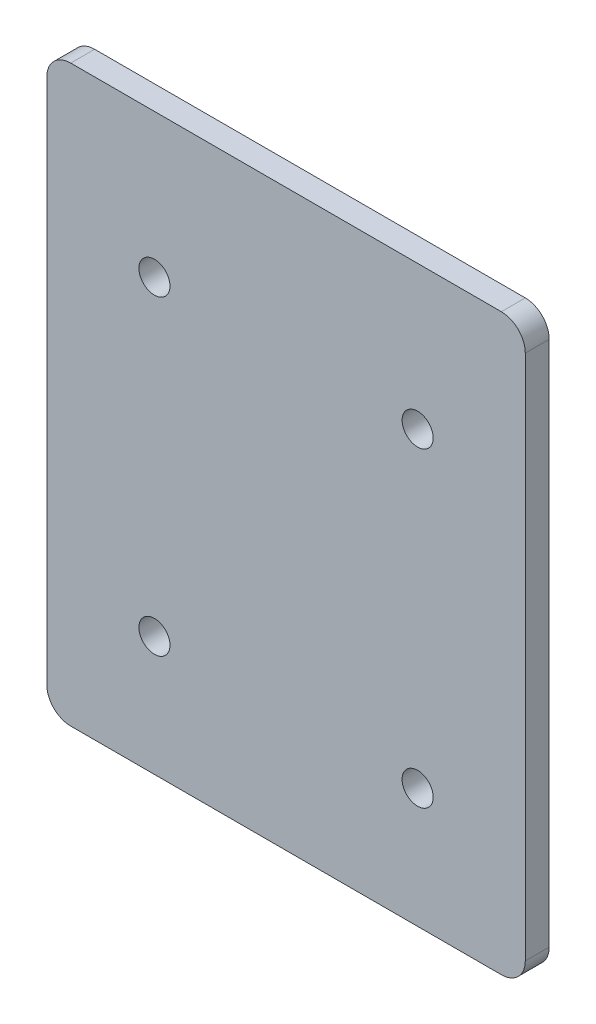
ISO-10303-21;
HEADER;
FILE_DESCRIPTION(('STEP AP214'),'2;1');
FILE_NAME('part.step','',(''),(''),'','','');
FILE_SCHEMA(('AUTOMOTIVE_DESIGN { 1 0 10303 214 1 1 1 1 }'));
ENDSEC;
DATA;
#1=APPLICATION_CONTEXT('core data for automotive mechanical design processes');
#2=APPLICATION_PROTOCOL_DEFINITION('international standard','automotive_design',2000,#1);
#3=PRODUCT_CONTEXT('',#1,'mechanical');
#4=PRODUCT('Part','Part','',(#3));
#5=PRODUCT_RELATED_PRODUCT_CATEGORY('part','',(#4));
#6=PRODUCT_DEFINITION_FORMATION('','',#4);
#7=PRODUCT_DEFINITION_CONTEXT('part definition',#1,'design');
#8=PRODUCT_DEFINITION('design','',#6,#7);
#9=PRODUCT_DEFINITION_SHAPE('','',#8);
#10=(LENGTH_UNIT() NAMED_UNIT(*) SI_UNIT(.MILLI.,.METRE.));
#11=(NAMED_UNIT(*) PLANE_ANGLE_UNIT() SI_UNIT($,.RADIAN.));
#12=(NAMED_UNIT(*) SI_UNIT($,.STERADIAN.) SOLID_ANGLE_UNIT());
#13=UNCERTAINTY_MEASURE_WITH_UNIT(LENGTH_MEASURE(1.E-05),#10,'distance_accuracy_value','');
#14=(GEOMETRIC_REPRESENTATION_CONTEXT(3) GLOBAL_UNCERTAINTY_ASSIGNED_CONTEXT((#13)) GLOBAL_UNIT_ASSIGNED_CONTEXT((#10,
#11,#12)) REPRESENTATION_CONTEXT('',''));
#15=CARTESIAN_POINT('',(0.,0.,0.));
#16=DIRECTION('',(0.,0.,1.));
#17=DIRECTION('',(1.,0.,0.));
#18=AXIS2_PLACEMENT_3D('',#15,#16,#17);
#19=CARTESIAN_POINT('',(50.,-60.,-5.));
#20=DIRECTION('',(1.,0.,0.));
#21=DIRECTION('',(0.,0.,-1.));
#22=AXIS2_PLACEMENT_3D('',#19,#20,#21);
#23=PLANE('',#22);
#24=DIRECTION('',(0.,1.,0.));
#25=VECTOR('',#24,1.);
#26=CARTESIAN_POINT('',(50.,-60.,-5.));
#27=LINE('',#26,#25);
#28=CARTESIAN_POINT('',(50.,-55.,-5.));
#29=VERTEX_POINT('',#28);
#30=CARTESIAN_POINT('',(50.,55.,-5.));
#31=VERTEX_POINT('',#30);
#32=EDGE_CURVE('E168',#29,#31,#27,.T.);
#33=ORIENTED_EDGE('',*,*,#32,.T.);
#34=DIRECTION('',(0.,0.,1.));
#35=VECTOR('',#34,1.);
#36=CARTESIAN_POINT('',(50.,55.,-5.));
#37=LINE('',#36,#35);
#38=CARTESIAN_POINT('',(50.,55.,0.));
#39=VERTEX_POINT('',#38);
#40=EDGE_CURVE('E122',#31,#39,#37,.T.);
#41=ORIENTED_EDGE('',*,*,#40,.T.);
#42=DIRECTION('',(0.,1.,0.));
#43=VECTOR('',#42,1.);
#44=CARTESIAN_POINT('',(50.,-60.,0.));
#45=LINE('',#44,#43);
#46=CARTESIAN_POINT('',(50.,-55.,0.));
#47=VERTEX_POINT('',#46);
#48=EDGE_CURVE('E106',#47,#39,#45,.T.);
#49=ORIENTED_EDGE('',*,*,#48,.F.);
#50=DIRECTION('',(0.,0.,1.));
#51=VECTOR('',#50,1.);
#52=CARTESIAN_POINT('',(50.,-55.,-5.));
#53=LINE('',#52,#51);
#54=EDGE_CURVE('E119',#47,#29,#53,.F.);
#55=ORIENTED_EDGE('',*,*,#54,.T.);
#56=EDGE_LOOP('',(#33,#41,#49,#55));
#57=FACE_BOUND('',#56,.T.);
#58=ADVANCED_FACE('F37',(#57),#23,.T.);
#59=CARTESIAN_POINT('',(-50.,-60.,-5.));
#60=DIRECTION('',(0.,-1.,0.));
#61=DIRECTION('',(0.,0.,-1.));
#62=AXIS2_PLACEMENT_3D('',#59,#60,#61);
#63=PLANE('',#62);
#64=DIRECTION('',(1.,0.,0.));
#65=VECTOR('',#64,1.);
#66=CARTESIAN_POINT('',(-50.,-60.,-5.));
#67=LINE('',#66,#65);
#68=CARTESIAN_POINT('',(-45.,-60.,-5.));
#69=VERTEX_POINT('',#68);
#70=CARTESIAN_POINT('',(45.,-60.,-5.));
#71=VERTEX_POINT('',#70);
#72=EDGE_CURVE('E129',#69,#71,#67,.T.);
#73=ORIENTED_EDGE('',*,*,#72,.T.);
#74=DIRECTION('',(0.,0.,1.));
#75=VECTOR('',#74,1.);
#76=CARTESIAN_POINT('',(45.,-60.,-5.));
#77=LINE('',#76,#75);
#78=CARTESIAN_POINT('',(45.,-60.,0.));
#79=VERTEX_POINT('',#78);
#80=EDGE_CURVE('E155',#71,#79,#77,.T.);
#81=ORIENTED_EDGE('',*,*,#80,.T.);
#82=DIRECTION('',(1.,0.,0.));
#83=VECTOR('',#82,1.);
#84=CARTESIAN_POINT('',(-50.,-60.,0.));
#85=LINE('',#84,#83);
#86=CARTESIAN_POINT('',(-45.,-60.,0.));
#87=VERTEX_POINT('',#86);
#88=EDGE_CURVE('E108',#87,#79,#85,.T.);
#89=ORIENTED_EDGE('',*,*,#88,.F.);
#90=DIRECTION('',(0.,0.,1.));
#91=VECTOR('',#90,1.);
#92=CARTESIAN_POINT('',(-45.,-60.,-5.));
#93=LINE('',#92,#91);
#94=EDGE_CURVE('E153',#87,#69,#93,.F.);
#95=ORIENTED_EDGE('',*,*,#94,.T.);
#96=EDGE_LOOP('',(#73,#81,#89,#95));
#97=FACE_BOUND('',#96,.T.);
#98=ADVANCED_FACE('F157',(#97),#63,.T.);
#99=CARTESIAN_POINT('',(-50.,-60.,-5.));
#100=DIRECTION('',(-1.,0.,0.));
#101=DIRECTION('',(0.,0.,1.));
#102=AXIS2_PLACEMENT_3D('',#99,#100,#101);
#103=PLANE('',#102);
#104=DIRECTION('',(0.,-1.,0.));
#105=VECTOR('',#104,1.);
#106=CARTESIAN_POINT('',(-50.,-60.,-5.));
#107=LINE('',#106,#105);
#108=CARTESIAN_POINT('',(-50.,55.,-5.));
#109=VERTEX_POINT('',#108);
#110=CARTESIAN_POINT('',(-50.,-55.,-5.));
#111=VERTEX_POINT('',#110);
#112=EDGE_CURVE('E134',#109,#111,#107,.T.);
#113=ORIENTED_EDGE('',*,*,#112,.T.);
#114=DIRECTION('',(0.,0.,1.));
#115=VECTOR('',#114,1.);
#116=CARTESIAN_POINT('',(-50.,-55.,-5.));
#117=LINE('',#116,#115);
#118=CARTESIAN_POINT('',(-50.,-55.,0.));
#119=VERTEX_POINT('',#118);
#120=EDGE_CURVE('E11',#111,#119,#117,.T.);
#121=ORIENTED_EDGE('',*,*,#120,.T.);
#122=DIRECTION('',(0.,-1.,0.));
#123=VECTOR('',#122,1.);
#124=CARTESIAN_POINT('',(-50.,-60.,0.));
#125=LINE('',#124,#123);
#126=CARTESIAN_POINT('',(-50.,55.,0.));
#127=VERTEX_POINT('',#126);
#128=EDGE_CURVE('E166',#127,#119,#125,.T.);
#129=ORIENTED_EDGE('',*,*,#128,.F.);
#130=DIRECTION('',(0.,0.,1.));
#131=VECTOR('',#130,1.);
#132=CARTESIAN_POINT('',(-50.,55.,-5.));
#133=LINE('',#132,#131);
#134=EDGE_CURVE('E45',#127,#109,#133,.F.);
#135=ORIENTED_EDGE('',*,*,#134,.T.);
#136=EDGE_LOOP('',(#113,#121,#129,#135));
#137=FACE_BOUND('',#136,.T.);
#138=ADVANCED_FACE('F165',(#137),#103,.T.);
#139=CARTESIAN_POINT('',(-50.,60.,-5.));
#140=DIRECTION('',(0.,1.,0.));
#141=DIRECTION('',(0.,0.,1.));
#142=AXIS2_PLACEMENT_3D('',#139,#140,#141);
#143=PLANE('',#142);
#144=DIRECTION('',(-1.,0.,0.));
#145=VECTOR('',#144,1.);
#146=CARTESIAN_POINT('',(-50.,60.,0.));
#147=LINE('',#146,#145);
#148=CARTESIAN_POINT('',(45.,60.,0.));
#149=VERTEX_POINT('',#148);
#150=CARTESIAN_POINT('',(-45.,60.,0.));
#151=VERTEX_POINT('',#150);
#152=EDGE_CURVE('E123',#149,#151,#147,.T.);
#153=ORIENTED_EDGE('',*,*,#152,.F.);
#154=DIRECTION('',(0.,0.,1.));
#155=VECTOR('',#154,1.);
#156=CARTESIAN_POINT('',(45.,60.,-5.));
#157=LINE('',#156,#155);
#158=CARTESIAN_POINT('',(45.,60.,-5.));
#159=VERTEX_POINT('',#158);
#160=EDGE_CURVE('E145',#149,#159,#157,.F.);
#161=ORIENTED_EDGE('',*,*,#160,.T.);
#162=DIRECTION('',(-1.,0.,0.));
#163=VECTOR('',#162,1.);
#164=CARTESIAN_POINT('',(-50.,60.,-5.));
#165=LINE('',#164,#163);
#166=CARTESIAN_POINT('',(-45.,60.,-5.));
#167=VERTEX_POINT('',#166);
#168=EDGE_CURVE('E172',#159,#167,#165,.T.);
#169=ORIENTED_EDGE('',*,*,#168,.T.);
#170=DIRECTION('',(0.,0.,1.));
#171=VECTOR('',#170,1.);
#172=CARTESIAN_POINT('',(-45.,60.,-5.));
#173=LINE('',#172,#171);
#174=EDGE_CURVE('E142',#167,#151,#173,.T.);
#175=ORIENTED_EDGE('',*,*,#174,.T.);
#176=EDGE_LOOP('',(#153,#161,#169,#175));
#177=FACE_BOUND('',#176,.T.);
#178=ADVANCED_FACE('F239',(#177),#143,.T.);
#179=CARTESIAN_POINT('',(0.,0.,-5.));
#180=DIRECTION('',(0.,0.,-1.));
#181=DIRECTION('',(-1.,0.,0.));
#182=AXIS2_PLACEMENT_3D('',#179,#180,#181);
#183=PLANE('',#182);
#184=CARTESIAN_POINT('',(27.5,-35.,-5.));
#185=DIRECTION('',(0.,0.,1.));
#186=DIRECTION('',(1.,0.,0.));
#187=AXIS2_PLACEMENT_3D('',#184,#185,#186);
#188=CIRCLE('',#187,3.25);
#189=CARTESIAN_POINT('',(30.75,-35.,-5.));
#190=VERTEX_POINT('',#189);
#191=EDGE_CURVE('E191',#190,#190,#188,.T.);
#192=ORIENTED_EDGE('',*,*,#191,.T.);
#193=EDGE_LOOP('',(#192));
#194=FACE_BOUND('',#193,.T.);
#195=CARTESIAN_POINT('',(-27.5,-35.,-5.));
#196=DIRECTION('',(0.,0.,1.));
#197=DIRECTION('',(1.,0.,0.));
#198=AXIS2_PLACEMENT_3D('',#195,#196,#197);
#199=CIRCLE('',#198,3.25);
#200=CARTESIAN_POINT('',(-24.25,-35.,-5.));
#201=VERTEX_POINT('',#200);
#202=EDGE_CURVE('E185',#201,#201,#199,.T.);
#203=ORIENTED_EDGE('',*,*,#202,.T.);
#204=EDGE_LOOP('',(#203));
#205=FACE_BOUND('',#204,.T.);
#206=CARTESIAN_POINT('',(27.5,30.,-5.));
#207=DIRECTION('',(0.,0.,1.));
#208=DIRECTION('',(1.,0.,0.));
#209=AXIS2_PLACEMENT_3D('',#206,#207,#208);
#210=CIRCLE('',#209,3.25);
#211=CARTESIAN_POINT('',(30.75,30.,-5.));
#212=VERTEX_POINT('',#211);
#213=EDGE_CURVE('E179',#212,#212,#210,.T.);
#214=ORIENTED_EDGE('',*,*,#213,.T.);
#215=EDGE_LOOP('',(#214));
#216=FACE_BOUND('',#215,.T.);
#217=CARTESIAN_POINT('',(-27.5,30.,-5.));
#218=DIRECTION('',(0.,0.,1.));
#219=DIRECTION('',(1.,0.,0.));
#220=AXIS2_PLACEMENT_3D('',#217,#218,#219);
#221=CIRCLE('',#220,3.25);
#222=CARTESIAN_POINT('',(-24.25,30.,-5.));
#223=VERTEX_POINT('',#222);
#224=EDGE_CURVE('E124',#223,#223,#221,.T.);
#225=ORIENTED_EDGE('',*,*,#224,.T.);
#226=EDGE_LOOP('',(#225));
#227=FACE_BOUND('',#226,.T.);
#228=ORIENTED_EDGE('',*,*,#168,.F.);
#229=CARTESIAN_POINT('',(45.,55.,-5.));
#230=DIRECTION('',(0.,0.,-1.));
#231=DIRECTION('',(-1.,0.,0.));
#232=AXIS2_PLACEMENT_3D('',#229,#230,#231);
#233=CIRCLE('',#232,5.);
#234=EDGE_CURVE('E151',#159,#31,#233,.T.);
#235=ORIENTED_EDGE('',*,*,#234,.T.);
#236=ORIENTED_EDGE('',*,*,#32,.F.);
#237=CARTESIAN_POINT('',(45.,-55.,-5.));
#238=DIRECTION('',(0.,0.,-1.));
#239=DIRECTION('',(-1.,0.,0.));
#240=AXIS2_PLACEMENT_3D('',#237,#238,#239);
#241=CIRCLE('',#240,5.);
#242=EDGE_CURVE('E128',#29,#71,#241,.T.);
#243=ORIENTED_EDGE('',*,*,#242,.T.);
#244=ORIENTED_EDGE('',*,*,#72,.F.);
#245=CARTESIAN_POINT('',(-45.,-55.,-5.));
#246=DIRECTION('',(0.,0.,-1.));
#247=DIRECTION('',(-1.,0.,0.));
#248=AXIS2_PLACEMENT_3D('',#245,#246,#247);
#249=CIRCLE('',#248,5.);
#250=EDGE_CURVE('E52',#69,#111,#249,.T.);
#251=ORIENTED_EDGE('',*,*,#250,.T.);
#252=ORIENTED_EDGE('',*,*,#112,.F.);
#253=CARTESIAN_POINT('',(-45.,55.,-5.));
#254=DIRECTION('',(0.,0.,-1.));
#255=DIRECTION('',(-1.,0.,0.));
#256=AXIS2_PLACEMENT_3D('',#253,#254,#255);
#257=CIRCLE('',#256,5.);
#258=EDGE_CURVE('E147',#109,#167,#257,.T.);
#259=ORIENTED_EDGE('',*,*,#258,.T.);
#260=EDGE_LOOP('',(#228,#235,#236,#243,#244,#251,#252,#259));
#261=FACE_BOUND('',#260,.T.);
#262=ADVANCED_FACE('F160',(#194,#205,#216,#227,#261),#183,.T.);
#263=CARTESIAN_POINT('',(0.,0.,0.));
#264=DIRECTION('',(0.,0.,-1.));
#265=DIRECTION('',(-1.,0.,0.));
#266=AXIS2_PLACEMENT_3D('',#263,#264,#265);
#267=PLANE('',#266);
#268=CARTESIAN_POINT('',(27.5,-35.,0.));
#269=DIRECTION('',(0.,0.,1.));
#270=DIRECTION('',(1.,0.,0.));
#271=AXIS2_PLACEMENT_3D('',#268,#269,#270);
#272=CIRCLE('',#271,3.25);
#273=CARTESIAN_POINT('',(30.75,-35.,0.));
#274=VERTEX_POINT('',#273);
#275=EDGE_CURVE('E194',#274,#274,#272,.T.);
#276=ORIENTED_EDGE('',*,*,#275,.F.);
#277=EDGE_LOOP('',(#276));
#278=FACE_BOUND('',#277,.T.);
#279=CARTESIAN_POINT('',(-27.5,-35.,0.));
#280=DIRECTION('',(0.,0.,1.));
#281=DIRECTION('',(1.,0.,0.));
#282=AXIS2_PLACEMENT_3D('',#279,#280,#281);
#283=CIRCLE('',#282,3.25);
#284=CARTESIAN_POINT('',(-24.25,-35.,0.));
#285=VERTEX_POINT('',#284);
#286=EDGE_CURVE('E188',#285,#285,#283,.T.);
#287=ORIENTED_EDGE('',*,*,#286,.F.);
#288=EDGE_LOOP('',(#287));
#289=FACE_BOUND('',#288,.T.);
#290=CARTESIAN_POINT('',(27.5,30.,0.));
#291=DIRECTION('',(0.,0.,1.));
#292=DIRECTION('',(1.,0.,0.));
#293=AXIS2_PLACEMENT_3D('',#290,#291,#292);
#294=CIRCLE('',#293,3.25);
#295=CARTESIAN_POINT('',(30.75,30.,0.));
#296=VERTEX_POINT('',#295);
#297=EDGE_CURVE('E182',#296,#296,#294,.T.);
#298=ORIENTED_EDGE('',*,*,#297,.F.);
#299=EDGE_LOOP('',(#298));
#300=FACE_BOUND('',#299,.T.);
#301=CARTESIAN_POINT('',(-27.5,30.,0.));
#302=DIRECTION('',(0.,0.,1.));
#303=DIRECTION('',(1.,0.,0.));
#304=AXIS2_PLACEMENT_3D('',#301,#302,#303);
#305=CIRCLE('',#304,3.25);
#306=CARTESIAN_POINT('',(-24.25,30.,0.));
#307=VERTEX_POINT('',#306);
#308=EDGE_CURVE('E176',#307,#307,#305,.T.);
#309=ORIENTED_EDGE('',*,*,#308,.F.);
#310=EDGE_LOOP('',(#309));
#311=FACE_BOUND('',#310,.T.);
#312=ORIENTED_EDGE('',*,*,#48,.T.);
#313=CARTESIAN_POINT('',(45.,55.,0.));
#314=DIRECTION('',(0.,0.,-1.));
#315=DIRECTION('',(-1.,0.,0.));
#316=AXIS2_PLACEMENT_3D('',#313,#314,#315);
#317=CIRCLE('',#316,5.);
#318=EDGE_CURVE('E113',#39,#149,#317,.F.);
#319=ORIENTED_EDGE('',*,*,#318,.T.);
#320=ORIENTED_EDGE('',*,*,#152,.T.);
#321=CARTESIAN_POINT('',(-45.,55.,0.));
#322=DIRECTION('',(0.,0.,-1.));
#323=DIRECTION('',(-1.,0.,0.));
#324=AXIS2_PLACEMENT_3D('',#321,#322,#323);
#325=CIRCLE('',#324,5.);
#326=EDGE_CURVE('E131',#151,#127,#325,.F.);
#327=ORIENTED_EDGE('',*,*,#326,.T.);
#328=ORIENTED_EDGE('',*,*,#128,.T.);
#329=CARTESIAN_POINT('',(-45.,-55.,0.));
#330=DIRECTION('',(0.,0.,-1.));
#331=DIRECTION('',(-1.,0.,0.));
#332=AXIS2_PLACEMENT_3D('',#329,#330,#331);
#333=CIRCLE('',#332,5.);
#334=EDGE_CURVE('E114',#119,#87,#333,.F.);
#335=ORIENTED_EDGE('',*,*,#334,.T.);
#336=ORIENTED_EDGE('',*,*,#88,.T.);
#337=CARTESIAN_POINT('',(45.,-55.,0.));
#338=DIRECTION('',(0.,0.,-1.));
#339=DIRECTION('',(-1.,0.,0.));
#340=AXIS2_PLACEMENT_3D('',#337,#338,#339);
#341=CIRCLE('',#340,5.);
#342=EDGE_CURVE('E103',#79,#47,#341,.F.);
#343=ORIENTED_EDGE('',*,*,#342,.T.);
#344=EDGE_LOOP('',(#312,#319,#320,#327,#328,#335,#336,#343));
#345=FACE_BOUND('',#344,.T.);
#346=ADVANCED_FACE('F105',(#278,#289,#300,#311,#345),#267,.F.);
#347=CARTESIAN_POINT('',(-27.5,30.,-5.));
#348=DIRECTION('',(0.,0.,1.));
#349=DIRECTION('',(1.,0.,0.));
#350=AXIS2_PLACEMENT_3D('',#347,#348,#349);
#351=CYLINDRICAL_SURFACE('',#350,3.25);
#352=ORIENTED_EDGE('',*,*,#224,.F.);
#353=EDGE_LOOP('',(#352));
#354=FACE_BOUND('',#353,.T.);
#355=ORIENTED_EDGE('',*,*,#308,.T.);
#356=EDGE_LOOP('',(#355));
#357=FACE_BOUND('',#356,.T.);
#358=ADVANCED_FACE('F212',(#354,#357),#351,.F.);
#359=CARTESIAN_POINT('',(27.5,30.,-5.));
#360=DIRECTION('',(0.,0.,1.));
#361=DIRECTION('',(1.,0.,0.));
#362=AXIS2_PLACEMENT_3D('',#359,#360,#361);
#363=CYLINDRICAL_SURFACE('',#362,3.25);
#364=ORIENTED_EDGE('',*,*,#213,.F.);
#365=EDGE_LOOP('',(#364));
#366=FACE_BOUND('',#365,.T.);
#367=ORIENTED_EDGE('',*,*,#297,.T.);
#368=EDGE_LOOP('',(#367));
#369=FACE_BOUND('',#368,.T.);
#370=ADVANCED_FACE('F221',(#366,#369),#363,.F.);
#371=CARTESIAN_POINT('',(-27.5,-35.,-5.));
#372=DIRECTION('',(0.,0.,1.));
#373=DIRECTION('',(1.,0.,0.));
#374=AXIS2_PLACEMENT_3D('',#371,#372,#373);
#375=CYLINDRICAL_SURFACE('',#374,3.25);
#376=ORIENTED_EDGE('',*,*,#202,.F.);
#377=EDGE_LOOP('',(#376));
#378=FACE_BOUND('',#377,.T.);
#379=ORIENTED_EDGE('',*,*,#286,.T.);
#380=EDGE_LOOP('',(#379));
#381=FACE_BOUND('',#380,.T.);
#382=ADVANCED_FACE('F206',(#378,#381),#375,.F.);
#383=CARTESIAN_POINT('',(27.5,-35.,-5.));
#384=DIRECTION('',(0.,0.,1.));
#385=DIRECTION('',(1.,0.,0.));
#386=AXIS2_PLACEMENT_3D('',#383,#384,#385);
#387=CYLINDRICAL_SURFACE('',#386,3.25);
#388=ORIENTED_EDGE('',*,*,#191,.F.);
#389=EDGE_LOOP('',(#388));
#390=FACE_BOUND('',#389,.T.);
#391=ORIENTED_EDGE('',*,*,#275,.T.);
#392=EDGE_LOOP('',(#391));
#393=FACE_BOUND('',#392,.T.);
#394=ADVANCED_FACE('F202',(#390,#393),#387,.F.);
#395=CARTESIAN_POINT('',(45.,55.,-5.));
#396=DIRECTION('',(0.,0.,1.));
#397=DIRECTION('',(1.,0.,0.));
#398=AXIS2_PLACEMENT_3D('',#395,#396,#397);
#399=CYLINDRICAL_SURFACE('',#398,5.);
#400=ORIENTED_EDGE('',*,*,#234,.F.);
#401=ORIENTED_EDGE('',*,*,#160,.F.);
#402=ORIENTED_EDGE('',*,*,#318,.F.);
#403=ORIENTED_EDGE('',*,*,#40,.F.);
#404=EDGE_LOOP('',(#400,#401,#402,#403));
#405=FACE_BOUND('',#404,.T.);
#406=ADVANCED_FACE('F205',(#405),#399,.T.);
#407=CARTESIAN_POINT('',(45.,-55.,-5.));
#408=DIRECTION('',(0.,0.,1.));
#409=DIRECTION('',(1.,0.,0.));
#410=AXIS2_PLACEMENT_3D('',#407,#408,#409);
#411=CYLINDRICAL_SURFACE('',#410,5.);
#412=ORIENTED_EDGE('',*,*,#242,.F.);
#413=ORIENTED_EDGE('',*,*,#54,.F.);
#414=ORIENTED_EDGE('',*,*,#342,.F.);
#415=ORIENTED_EDGE('',*,*,#80,.F.);
#416=EDGE_LOOP('',(#412,#413,#414,#415));
#417=FACE_BOUND('',#416,.T.);
#418=ADVANCED_FACE('F127',(#417),#411,.T.);
#419=CARTESIAN_POINT('',(-45.,-55.,-5.));
#420=DIRECTION('',(0.,0.,1.));
#421=DIRECTION('',(1.,0.,0.));
#422=AXIS2_PLACEMENT_3D('',#419,#420,#421);
#423=CYLINDRICAL_SURFACE('',#422,5.);
#424=ORIENTED_EDGE('',*,*,#250,.F.);
#425=ORIENTED_EDGE('',*,*,#94,.F.);
#426=ORIENTED_EDGE('',*,*,#334,.F.);
#427=ORIENTED_EDGE('',*,*,#120,.F.);
#428=EDGE_LOOP('',(#424,#425,#426,#427));
#429=FACE_BOUND('',#428,.T.);
#430=ADVANCED_FACE('F163',(#429),#423,.T.);
#431=CARTESIAN_POINT('',(-45.,55.,-5.));
#432=DIRECTION('',(0.,0.,1.));
#433=DIRECTION('',(1.,0.,0.));
#434=AXIS2_PLACEMENT_3D('',#431,#432,#433);
#435=CYLINDRICAL_SURFACE('',#434,5.);
#436=ORIENTED_EDGE('',*,*,#258,.F.);
#437=ORIENTED_EDGE('',*,*,#134,.F.);
#438=ORIENTED_EDGE('',*,*,#326,.F.);
#439=ORIENTED_EDGE('',*,*,#174,.F.);
#440=EDGE_LOOP('',(#436,#437,#438,#439));
#441=FACE_BOUND('',#440,.T.);
#442=ADVANCED_FACE('F39',(#441),#435,.T.);
#443=CLOSED_SHELL('',(#58,#98,#138,#178,#262,#346,#358,#370,#382,#394,#406,#418,#430,#442));
#444=MANIFOLD_SOLID_BREP('B2',#443);
#445=ADVANCED_BREP_SHAPE_REPRESENTATION('',(#18,#444),#14);
#446=SHAPE_DEFINITION_REPRESENTATION(#9,#445);
ENDSEC;
END-ISO-10303-21;
